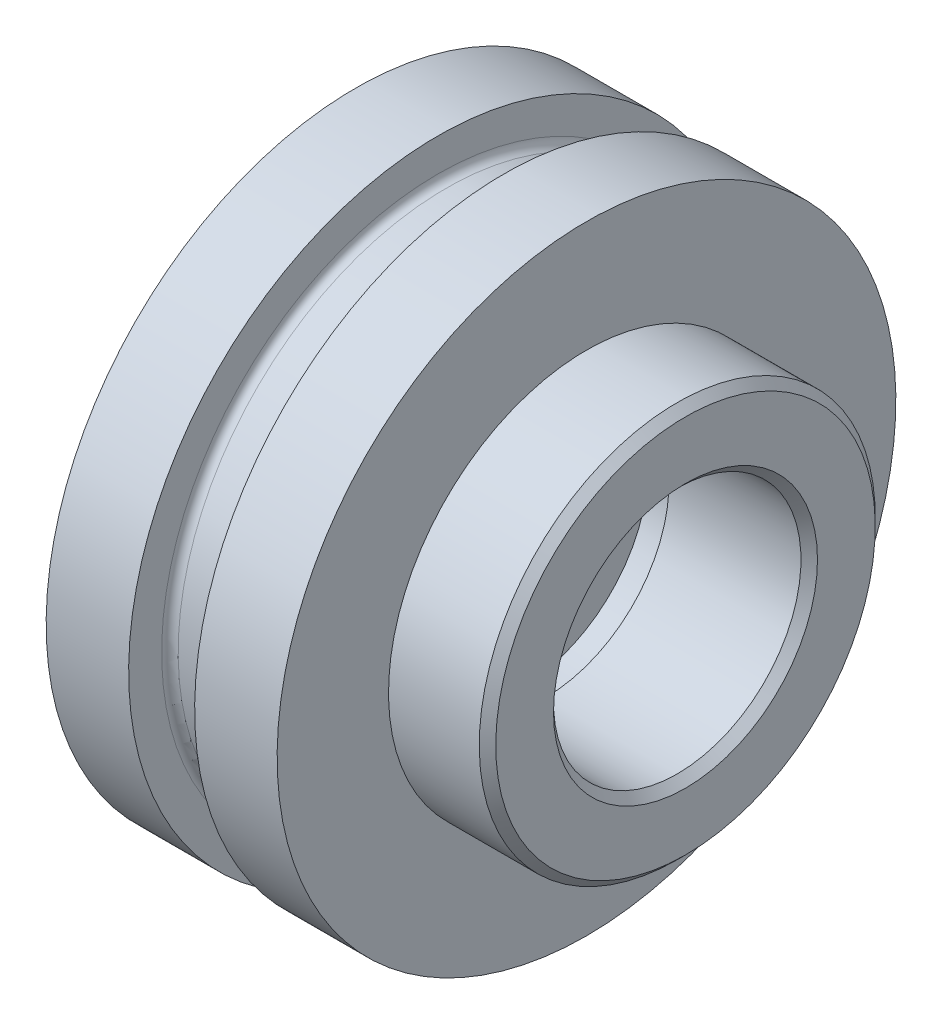
ISO-10303-21;
HEADER;
FILE_DESCRIPTION(('STEP AP214'),'2;1');
FILE_NAME('part.step','',(''),(''),'','','');
FILE_SCHEMA(('AUTOMOTIVE_DESIGN { 1 0 10303 214 1 1 1 1 }'));
ENDSEC;
DATA;
#1=APPLICATION_CONTEXT('core data for automotive mechanical design processes');
#2=APPLICATION_PROTOCOL_DEFINITION('international standard','automotive_design',2000,#1);
#3=PRODUCT_CONTEXT('',#1,'mechanical');
#4=PRODUCT('Part','Part','',(#3));
#5=PRODUCT_RELATED_PRODUCT_CATEGORY('part','',(#4));
#6=PRODUCT_DEFINITION_FORMATION('','',#4);
#7=PRODUCT_DEFINITION_CONTEXT('part definition',#1,'design');
#8=PRODUCT_DEFINITION('design','',#6,#7);
#9=PRODUCT_DEFINITION_SHAPE('','',#8);
#10=(LENGTH_UNIT() NAMED_UNIT(*) SI_UNIT(.MILLI.,.METRE.));
#11=(NAMED_UNIT(*) PLANE_ANGLE_UNIT() SI_UNIT($,.RADIAN.));
#12=(NAMED_UNIT(*) SI_UNIT($,.STERADIAN.) SOLID_ANGLE_UNIT());
#13=UNCERTAINTY_MEASURE_WITH_UNIT(LENGTH_MEASURE(1.E-05),#10,'distance_accuracy_value','');
#14=(GEOMETRIC_REPRESENTATION_CONTEXT(3) GLOBAL_UNCERTAINTY_ASSIGNED_CONTEXT((#13)) GLOBAL_UNIT_ASSIGNED_CONTEXT((#10,
#11,#12)) REPRESENTATION_CONTEXT('',''));
#15=CARTESIAN_POINT('',(0.,0.,0.));
#16=DIRECTION('',(0.,0.,1.));
#17=DIRECTION('',(1.,0.,0.));
#18=AXIS2_PLACEMENT_3D('',#15,#16,#17);
#19=CARTESIAN_POINT('',(20.,15.5,0.));
#20=DIRECTION('',(-1.,0.,0.));
#21=DIRECTION('',(0.,-1.,0.));
#22=AXIS2_PLACEMENT_3D('',#19,#20,#21);
#23=PLANE('',#22);
#24=CARTESIAN_POINT('',(20.,0.,0.));
#25=DIRECTION('',(-1.,0.,0.));
#26=DIRECTION('',(0.,-1.,0.));
#27=AXIS2_PLACEMENT_3D('',#24,#25,#26);
#28=CIRCLE('',#27,15.5);
#29=CARTESIAN_POINT('',(20.,-15.5,0.));
#30=VERTEX_POINT('',#29);
#31=EDGE_CURVE('E10',#30,#30,#28,.T.);
#32=ORIENTED_EDGE('',*,*,#31,.F.);
#33=EDGE_LOOP('',(#32));
#34=FACE_BOUND('',#33,.T.);
#35=ADVANCED_FACE('F34',(#34),#23,.F.);
#36=CARTESIAN_POINT('',(2.00000000000001,0.,0.));
#37=DIRECTION('',(-1.,0.,0.));
#38=DIRECTION('',(0.,-1.,0.));
#39=AXIS2_PLACEMENT_3D('',#36,#37,#38);
#40=CYLINDRICAL_SURFACE('',#39,15.5);
#41=CARTESIAN_POINT('',(23.,0.,0.));
#42=DIRECTION('',(-1.,0.,0.));
#43=DIRECTION('',(0.,-1.,0.));
#44=AXIS2_PLACEMENT_3D('',#41,#42,#43);
#45=CIRCLE('',#44,15.5);
#46=CARTESIAN_POINT('',(23.,-15.5,0.));
#47=VERTEX_POINT('',#46);
#48=EDGE_CURVE('E40',#47,#47,#45,.T.);
#49=ORIENTED_EDGE('',*,*,#48,.F.);
#50=EDGE_LOOP('',(#49));
#51=FACE_BOUND('',#50,.T.);
#52=ORIENTED_EDGE('',*,*,#31,.T.);
#53=EDGE_LOOP('',(#52));
#54=FACE_BOUND('',#53,.T.);
#55=ADVANCED_FACE('F190',(#51,#54),#40,.F.);
#56=CARTESIAN_POINT('',(23.,15.,0.));
#57=DIRECTION('',(1.,0.,0.));
#58=DIRECTION('',(0.,1.,0.));
#59=AXIS2_PLACEMENT_3D('',#56,#57,#58);
#60=PLANE('',#59);
#61=CARTESIAN_POINT('',(23.,0.,0.));
#62=DIRECTION('',(-1.,0.,0.));
#63=DIRECTION('',(0.,-1.,0.));
#64=AXIS2_PLACEMENT_3D('',#61,#62,#63);
#65=CIRCLE('',#64,15.);
#66=CARTESIAN_POINT('',(23.,-15.,0.));
#67=VERTEX_POINT('',#66);
#68=EDGE_CURVE('E44',#67,#67,#65,.T.);
#69=ORIENTED_EDGE('',*,*,#68,.F.);
#70=EDGE_LOOP('',(#69));
#71=FACE_BOUND('',#70,.T.);
#72=ORIENTED_EDGE('',*,*,#48,.T.);
#73=EDGE_LOOP('',(#72));
#74=FACE_BOUND('',#73,.T.);
#75=ADVANCED_FACE('F185',(#71,#74),#60,.F.);
#76=CARTESIAN_POINT('',(2.00000000000001,0.,0.));
#77=DIRECTION('',(-1.,0.,0.));
#78=DIRECTION('',(0.,-1.,0.));
#79=AXIS2_PLACEMENT_3D('',#76,#77,#78);
#80=CYLINDRICAL_SURFACE('',#79,15.);
#81=CARTESIAN_POINT('',(39.,0.,0.));
#82=DIRECTION('',(-1.,0.,0.));
#83=DIRECTION('',(0.,-1.,0.));
#84=AXIS2_PLACEMENT_3D('',#81,#82,#83);
#85=CIRCLE('',#84,15.);
#86=CARTESIAN_POINT('',(39.,-15.,0.));
#87=VERTEX_POINT('',#86);
#88=EDGE_CURVE('E48',#87,#87,#85,.T.);
#89=ORIENTED_EDGE('',*,*,#88,.F.);
#90=EDGE_LOOP('',(#89));
#91=FACE_BOUND('',#90,.T.);
#92=ORIENTED_EDGE('',*,*,#68,.T.);
#93=EDGE_LOOP('',(#92));
#94=FACE_BOUND('',#93,.T.);
#95=ADVANCED_FACE('F179',(#91,#94),#80,.F.);
#96=CARTESIAN_POINT('',(39.,0.,0.));
#97=DIRECTION('',(1.,0.,0.));
#98=DIRECTION('',(0.,1.,0.));
#99=AXIS2_PLACEMENT_3D('',#96,#97,#98);
#100=CONICAL_SURFACE('',#99,15.,0.785398163397447);
#101=CARTESIAN_POINT('',(40.,0.,0.));
#102=DIRECTION('',(-1.,0.,0.));
#103=DIRECTION('',(0.,-1.,0.));
#104=AXIS2_PLACEMENT_3D('',#101,#102,#103);
#105=CIRCLE('',#104,16.);
#106=CARTESIAN_POINT('',(40.,-16.,0.));
#107=VERTEX_POINT('',#106);
#108=EDGE_CURVE('E53',#107,#107,#105,.T.);
#109=ORIENTED_EDGE('',*,*,#108,.F.);
#110=EDGE_LOOP('',(#109));
#111=FACE_BOUND('',#110,.T.);
#112=ORIENTED_EDGE('',*,*,#88,.T.);
#113=EDGE_LOOP('',(#112));
#114=FACE_BOUND('',#113,.T.);
#115=ADVANCED_FACE('F173',(#111,#114),#100,.F.);
#116=CARTESIAN_POINT('',(40.,23.,0.));
#117=DIRECTION('',(-1.,0.,0.));
#118=DIRECTION('',(0.,-1.,0.));
#119=AXIS2_PLACEMENT_3D('',#116,#117,#118);
#120=PLANE('',#119);
#121=CARTESIAN_POINT('',(40.,0.,0.));
#122=DIRECTION('',(-1.,0.,0.));
#123=DIRECTION('',(0.,-1.,0.));
#124=AXIS2_PLACEMENT_3D('',#121,#122,#123);
#125=CIRCLE('',#124,23.);
#126=CARTESIAN_POINT('',(40.,-23.,0.));
#127=VERTEX_POINT('',#126);
#128=EDGE_CURVE('E56',#127,#127,#125,.T.);
#129=ORIENTED_EDGE('',*,*,#128,.F.);
#130=EDGE_LOOP('',(#129));
#131=FACE_BOUND('',#130,.T.);
#132=ORIENTED_EDGE('',*,*,#108,.T.);
#133=EDGE_LOOP('',(#132));
#134=FACE_BOUND('',#133,.T.);
#135=ADVANCED_FACE('F167',(#131,#134),#120,.F.);
#136=CARTESIAN_POINT('',(40.,0.,0.));
#137=DIRECTION('',(-1.,0.,0.));
#138=DIRECTION('',(0.,-1.,0.));
#139=AXIS2_PLACEMENT_3D('',#136,#137,#138);
#140=CONICAL_SURFACE('',#139,23.,0.785398163397447);
#141=CARTESIAN_POINT('',(39.,0.,0.));
#142=DIRECTION('',(-1.,0.,0.));
#143=DIRECTION('',(0.,-1.,0.));
#144=AXIS2_PLACEMENT_3D('',#141,#142,#143);
#145=CIRCLE('',#144,24.);
#146=CARTESIAN_POINT('',(39.,-24.,0.));
#147=VERTEX_POINT('',#146);
#148=EDGE_CURVE('E59',#147,#147,#145,.T.);
#149=ORIENTED_EDGE('',*,*,#148,.F.);
#150=EDGE_LOOP('',(#149));
#151=FACE_BOUND('',#150,.T.);
#152=ORIENTED_EDGE('',*,*,#128,.T.);
#153=EDGE_LOOP('',(#152));
#154=FACE_BOUND('',#153,.T.);
#155=ADVANCED_FACE('F161',(#151,#154),#140,.T.);
#156=CARTESIAN_POINT('',(2.00000000000001,0.,0.));
#157=DIRECTION('',(-1.,0.,0.));
#158=DIRECTION('',(0.,-1.,0.));
#159=AXIS2_PLACEMENT_3D('',#156,#157,#158);
#160=CYLINDRICAL_SURFACE('',#159,24.);
#161=CARTESIAN_POINT('',(28.,0.,0.));
#162=DIRECTION('',(-1.,0.,0.));
#163=DIRECTION('',(0.,-1.,0.));
#164=AXIS2_PLACEMENT_3D('',#161,#162,#163);
#165=CIRCLE('',#164,24.);
#166=CARTESIAN_POINT('',(28.,-24.,0.));
#167=VERTEX_POINT('',#166);
#168=EDGE_CURVE('E62',#167,#167,#165,.T.);
#169=ORIENTED_EDGE('',*,*,#168,.F.);
#170=EDGE_LOOP('',(#169));
#171=FACE_BOUND('',#170,.T.);
#172=ORIENTED_EDGE('',*,*,#148,.T.);
#173=EDGE_LOOP('',(#172));
#174=FACE_BOUND('',#173,.T.);
#175=ADVANCED_FACE('F155',(#171,#174),#160,.T.);
#176=CARTESIAN_POINT('',(28.,37.5,0.));
#177=DIRECTION('',(-1.,0.,0.));
#178=DIRECTION('',(0.,-1.,0.));
#179=AXIS2_PLACEMENT_3D('',#176,#177,#178);
#180=PLANE('',#179);
#181=CARTESIAN_POINT('',(28.,0.,0.));
#182=DIRECTION('',(-1.,0.,0.));
#183=DIRECTION('',(0.,-1.,0.));
#184=AXIS2_PLACEMENT_3D('',#181,#182,#183);
#185=CIRCLE('',#184,37.5);
#186=CARTESIAN_POINT('',(28.,-37.5,0.));
#187=VERTEX_POINT('',#186);
#188=EDGE_CURVE('E65',#187,#187,#185,.T.);
#189=ORIENTED_EDGE('',*,*,#188,.F.);
#190=EDGE_LOOP('',(#189));
#191=FACE_BOUND('',#190,.T.);
#192=ORIENTED_EDGE('',*,*,#168,.T.);
#193=EDGE_LOOP('',(#192));
#194=FACE_BOUND('',#193,.T.);
#195=ADVANCED_FACE('F149',(#191,#194),#180,.F.);
#196=CARTESIAN_POINT('',(2.00000000000001,0.,0.));
#197=DIRECTION('',(-1.,0.,0.));
#198=DIRECTION('',(0.,-1.,0.));
#199=AXIS2_PLACEMENT_3D('',#196,#197,#198);
#200=CYLINDRICAL_SURFACE('',#199,37.5);
#201=CARTESIAN_POINT('',(18.,0.,0.));
#202=DIRECTION('',(-1.,0.,0.));
#203=DIRECTION('',(0.,-1.,0.));
#204=AXIS2_PLACEMENT_3D('',#201,#202,#203);
#205=CIRCLE('',#204,37.5);
#206=CARTESIAN_POINT('',(18.,-37.5,0.));
#207=VERTEX_POINT('',#206);
#208=EDGE_CURVE('E68',#207,#207,#205,.T.);
#209=ORIENTED_EDGE('',*,*,#208,.F.);
#210=EDGE_LOOP('',(#209));
#211=FACE_BOUND('',#210,.T.);
#212=ORIENTED_EDGE('',*,*,#188,.T.);
#213=EDGE_LOOP('',(#212));
#214=FACE_BOUND('',#213,.T.);
#215=ADVANCED_FACE('F143',(#211,#214),#200,.T.);
#216=CARTESIAN_POINT('',(18.,33.5,0.));
#217=DIRECTION('',(1.,0.,0.));
#218=DIRECTION('',(0.,1.,0.));
#219=AXIS2_PLACEMENT_3D('',#216,#217,#218);
#220=PLANE('',#219);
#221=CARTESIAN_POINT('',(18.,0.,0.));
#222=DIRECTION('',(-1.,0.,0.));
#223=DIRECTION('',(0.,-1.,0.));
#224=AXIS2_PLACEMENT_3D('',#221,#222,#223);
#225=CIRCLE('',#224,33.5);
#226=CARTESIAN_POINT('',(18.,-33.5,0.));
#227=VERTEX_POINT('',#226);
#228=EDGE_CURVE('E71',#227,#227,#225,.T.);
#229=ORIENTED_EDGE('',*,*,#228,.F.);
#230=EDGE_LOOP('',(#229));
#231=FACE_BOUND('',#230,.T.);
#232=ORIENTED_EDGE('',*,*,#208,.T.);
#233=EDGE_LOOP('',(#232));
#234=FACE_BOUND('',#233,.T.);
#235=ADVANCED_FACE('F137',(#231,#234),#220,.F.);
#236=CARTESIAN_POINT('',(17.,0.,0.));
#237=DIRECTION('',(-1.,0.,0.));
#238=DIRECTION('',(0.,-1.,0.));
#239=AXIS2_PLACEMENT_3D('',#236,#237,#238);
#240=TOROIDAL_SURFACE('',#239,33.5,1.);
#241=CARTESIAN_POINT('',(17.,0.,0.));
#242=DIRECTION('',(-1.,0.,0.));
#243=DIRECTION('',(0.,-1.,0.));
#244=AXIS2_PLACEMENT_3D('',#241,#242,#243);
#245=CIRCLE('',#244,32.5);
#246=CARTESIAN_POINT('',(17.,-32.5,0.));
#247=VERTEX_POINT('',#246);
#248=EDGE_CURVE('E74',#247,#247,#245,.T.);
#249=ORIENTED_EDGE('',*,*,#248,.F.);
#250=EDGE_LOOP('',(#249));
#251=FACE_BOUND('',#250,.T.);
#252=ORIENTED_EDGE('',*,*,#228,.T.);
#253=EDGE_LOOP('',(#252));
#254=FACE_BOUND('',#253,.T.);
#255=ADVANCED_FACE('F131',(#251,#254),#240,.F.);
#256=CARTESIAN_POINT('',(2.00000000000001,0.,0.));
#257=DIRECTION('',(-1.,0.,0.));
#258=DIRECTION('',(0.,-1.,0.));
#259=AXIS2_PLACEMENT_3D('',#256,#257,#258);
#260=CYLINDRICAL_SURFACE('',#259,32.5);
#261=CARTESIAN_POINT('',(11.,0.,0.));
#262=DIRECTION('',(-1.,0.,0.));
#263=DIRECTION('',(0.,-1.,0.));
#264=AXIS2_PLACEMENT_3D('',#261,#262,#263);
#265=CIRCLE('',#264,32.5);
#266=CARTESIAN_POINT('',(11.,-32.5,0.));
#267=VERTEX_POINT('',#266);
#268=EDGE_CURVE('E77',#267,#267,#265,.T.);
#269=ORIENTED_EDGE('',*,*,#268,.F.);
#270=EDGE_LOOP('',(#269));
#271=FACE_BOUND('',#270,.T.);
#272=ORIENTED_EDGE('',*,*,#248,.T.);
#273=EDGE_LOOP('',(#272));
#274=FACE_BOUND('',#273,.T.);
#275=ADVANCED_FACE('F125',(#271,#274),#260,.T.);
#276=CARTESIAN_POINT('',(11.,0.,0.));
#277=DIRECTION('',(-1.,0.,0.));
#278=DIRECTION('',(0.,-1.,0.));
#279=AXIS2_PLACEMENT_3D('',#276,#277,#278);
#280=TOROIDAL_SURFACE('',#279,33.5,1.);
#281=CARTESIAN_POINT('',(10.,0.,0.));
#282=DIRECTION('',(-1.,0.,0.));
#283=DIRECTION('',(0.,-1.,0.));
#284=AXIS2_PLACEMENT_3D('',#281,#282,#283);
#285=CIRCLE('',#284,33.5);
#286=CARTESIAN_POINT('',(10.,-33.5,0.));
#287=VERTEX_POINT('',#286);
#288=EDGE_CURVE('E80',#287,#287,#285,.T.);
#289=ORIENTED_EDGE('',*,*,#288,.F.);
#290=EDGE_LOOP('',(#289));
#291=FACE_BOUND('',#290,.T.);
#292=ORIENTED_EDGE('',*,*,#268,.T.);
#293=EDGE_LOOP('',(#292));
#294=FACE_BOUND('',#293,.T.);
#295=ADVANCED_FACE('F119',(#291,#294),#280,.F.);
#296=CARTESIAN_POINT('',(10.,37.5,0.));
#297=DIRECTION('',(-1.,0.,0.));
#298=DIRECTION('',(0.,-1.,0.));
#299=AXIS2_PLACEMENT_3D('',#296,#297,#298);
#300=PLANE('',#299);
#301=CARTESIAN_POINT('',(10.,0.,0.));
#302=DIRECTION('',(-1.,0.,0.));
#303=DIRECTION('',(0.,-1.,0.));
#304=AXIS2_PLACEMENT_3D('',#301,#302,#303);
#305=CIRCLE('',#304,37.5);
#306=CARTESIAN_POINT('',(10.,-37.5,0.));
#307=VERTEX_POINT('',#306);
#308=EDGE_CURVE('E83',#307,#307,#305,.T.);
#309=ORIENTED_EDGE('',*,*,#308,.F.);
#310=EDGE_LOOP('',(#309));
#311=FACE_BOUND('',#310,.T.);
#312=ORIENTED_EDGE('',*,*,#288,.T.);
#313=EDGE_LOOP('',(#312));
#314=FACE_BOUND('',#313,.T.);
#315=ADVANCED_FACE('F113',(#311,#314),#300,.F.);
#316=CARTESIAN_POINT('',(2.00000000000001,0.,0.));
#317=DIRECTION('',(-1.,0.,0.));
#318=DIRECTION('',(0.,-1.,0.));
#319=AXIS2_PLACEMENT_3D('',#316,#317,#318);
#320=CYLINDRICAL_SURFACE('',#319,37.5);
#321=CARTESIAN_POINT('',(0.,0.,0.));
#322=DIRECTION('',(-1.,0.,0.));
#323=DIRECTION('',(0.,-1.,0.));
#324=AXIS2_PLACEMENT_3D('',#321,#322,#323);
#325=CIRCLE('',#324,37.5);
#326=CARTESIAN_POINT('',(0.,-37.5,0.));
#327=VERTEX_POINT('',#326);
#328=EDGE_CURVE('E86',#327,#327,#325,.T.);
#329=ORIENTED_EDGE('',*,*,#328,.F.);
#330=EDGE_LOOP('',(#329));
#331=FACE_BOUND('',#330,.T.);
#332=ORIENTED_EDGE('',*,*,#308,.T.);
#333=EDGE_LOOP('',(#332));
#334=FACE_BOUND('',#333,.T.);
#335=ADVANCED_FACE('F107',(#331,#334),#320,.T.);
#336=CARTESIAN_POINT('',(0.,34.5,0.));
#337=DIRECTION('',(1.,0.,0.));
#338=DIRECTION('',(0.,1.,0.));
#339=AXIS2_PLACEMENT_3D('',#336,#337,#338);
#340=PLANE('',#339);
#341=CARTESIAN_POINT('',(0.,0.,0.));
#342=DIRECTION('',(-1.,0.,0.));
#343=DIRECTION('',(0.,-1.,0.));
#344=AXIS2_PLACEMENT_3D('',#341,#342,#343);
#345=CIRCLE('',#344,34.5);
#346=CARTESIAN_POINT('',(0.,-34.5,0.));
#347=VERTEX_POINT('',#346);
#348=EDGE_CURVE('E89',#347,#347,#345,.T.);
#349=ORIENTED_EDGE('',*,*,#348,.F.);
#350=EDGE_LOOP('',(#349));
#351=FACE_BOUND('',#350,.T.);
#352=ORIENTED_EDGE('',*,*,#328,.T.);
#353=EDGE_LOOP('',(#352));
#354=FACE_BOUND('',#353,.T.);
#355=ADVANCED_FACE('F101',(#351,#354),#340,.F.);
#356=CARTESIAN_POINT('',(2.00000000000001,0.,0.));
#357=DIRECTION('',(-1.,0.,0.));
#358=DIRECTION('',(0.,-1.,0.));
#359=AXIS2_PLACEMENT_3D('',#356,#357,#358);
#360=CYLINDRICAL_SURFACE('',#359,34.5);
#361=CARTESIAN_POINT('',(2.,0.,0.));
#362=DIRECTION('',(-1.,0.,0.));
#363=DIRECTION('',(0.,-1.,0.));
#364=AXIS2_PLACEMENT_3D('',#361,#362,#363);
#365=CIRCLE('',#364,34.5);
#366=CARTESIAN_POINT('',(2.,-34.5,0.));
#367=VERTEX_POINT('',#366);
#368=EDGE_CURVE('E92',#367,#367,#365,.T.);
#369=ORIENTED_EDGE('',*,*,#368,.F.);
#370=EDGE_LOOP('',(#369));
#371=FACE_BOUND('',#370,.T.);
#372=ORIENTED_EDGE('',*,*,#348,.T.);
#373=EDGE_LOOP('',(#372));
#374=FACE_BOUND('',#373,.T.);
#375=ADVANCED_FACE('F98',(#371,#374),#360,.F.);
#376=CARTESIAN_POINT('',(2.,34.5,0.));
#377=DIRECTION('',(1.,0.,0.));
#378=DIRECTION('',(0.,1.,0.));
#379=AXIS2_PLACEMENT_3D('',#376,#377,#378);
#380=PLANE('',#379);
#381=ORIENTED_EDGE('',*,*,#368,.T.);
#382=EDGE_LOOP('',(#381));
#383=FACE_BOUND('',#382,.T.);
#384=ADVANCED_FACE('F96',(#383),#380,.F.);
#385=CLOSED_SHELL('',(#35,#55,#75,#95,#115,#135,#155,#175,#195,#215,#235,#255,#275,#295,#315,
#335,#355,#375,#384));
#386=MANIFOLD_SOLID_BREP('B2',#385);
#387=ADVANCED_BREP_SHAPE_REPRESENTATION('',(#18,#386),#14);
#388=SHAPE_DEFINITION_REPRESENTATION(#9,#387);
ENDSEC;
END-ISO-10303-21;
